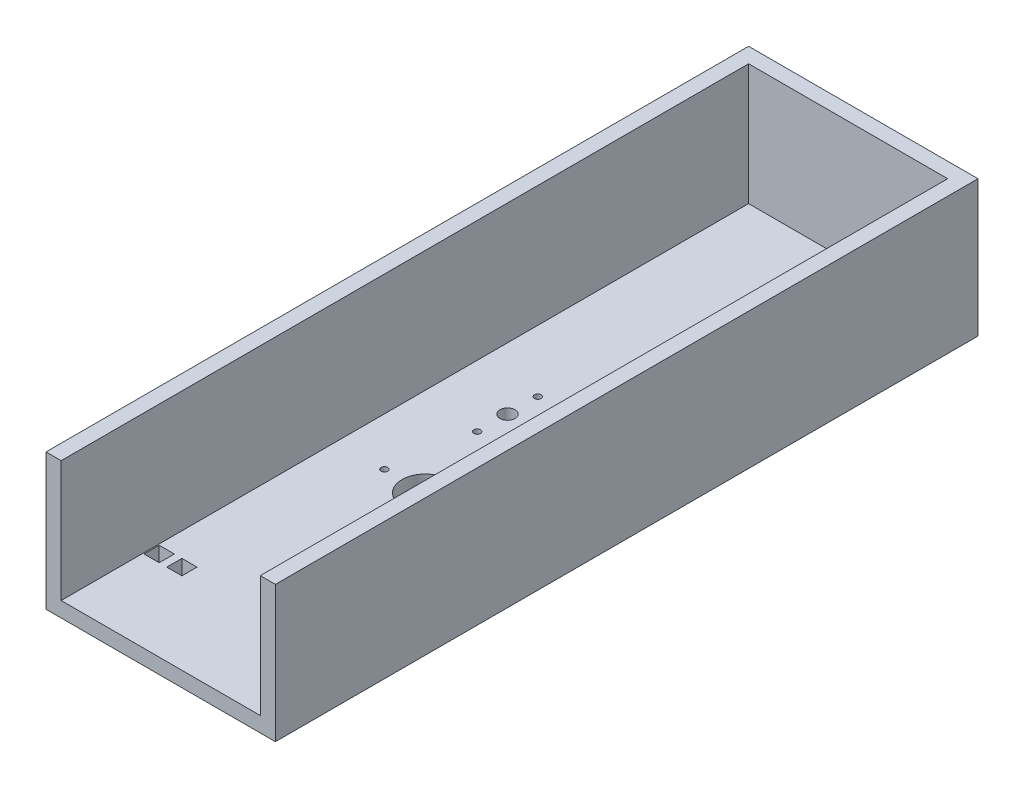
ISO-10303-21;
HEADER;
FILE_DESCRIPTION(('STEP AP214'),'2;1');
FILE_NAME('part.step','',(''),(''),'','','');
FILE_SCHEMA(('AUTOMOTIVE_DESIGN { 1 0 10303 214 1 1 1 1 }'));
ENDSEC;
DATA;
#1=APPLICATION_CONTEXT('core data for automotive mechanical design processes');
#2=APPLICATION_PROTOCOL_DEFINITION('international standard','automotive_design',2000,#1);
#3=PRODUCT_CONTEXT('',#1,'mechanical');
#4=PRODUCT('Part','Part','',(#3));
#5=PRODUCT_RELATED_PRODUCT_CATEGORY('part','',(#4));
#6=PRODUCT_DEFINITION_FORMATION('','',#4);
#7=PRODUCT_DEFINITION_CONTEXT('part definition',#1,'design');
#8=PRODUCT_DEFINITION('design','',#6,#7);
#9=PRODUCT_DEFINITION_SHAPE('','',#8);
#10=(LENGTH_UNIT() NAMED_UNIT(*) SI_UNIT(.MILLI.,.METRE.));
#11=(NAMED_UNIT(*) PLANE_ANGLE_UNIT() SI_UNIT($,.RADIAN.));
#12=(NAMED_UNIT(*) SI_UNIT($,.STERADIAN.) SOLID_ANGLE_UNIT());
#13=UNCERTAINTY_MEASURE_WITH_UNIT(LENGTH_MEASURE(1.E-05),#10,'distance_accuracy_value','');
#14=(GEOMETRIC_REPRESENTATION_CONTEXT(3) GLOBAL_UNCERTAINTY_ASSIGNED_CONTEXT((#13)) GLOBAL_UNIT_ASSIGNED_CONTEXT((#10,
#11,#12)) REPRESENTATION_CONTEXT('',''));
#15=CARTESIAN_POINT('',(0.,0.,0.));
#16=DIRECTION('',(0.,0.,1.));
#17=DIRECTION('',(1.,0.,0.));
#18=AXIS2_PLACEMENT_3D('',#15,#16,#17);
#19=CARTESIAN_POINT('',(41.75,22.225,294.64));
#20=DIRECTION('',(-1.,0.,0.));
#21=DIRECTION('',(0.,0.,1.));
#22=AXIS2_PLACEMENT_3D('',#19,#20,#21);
#23=PLANE('',#22);
#24=DIRECTION('',(0.,0.,-1.));
#25=VECTOR('',#24,1.);
#26=CARTESIAN_POINT('',(41.75,50.8,294.64));
#27=LINE('',#26,#25);
#28=CARTESIAN_POINT('',(41.75,50.8,294.64));
#29=VERTEX_POINT('',#28);
#30=CARTESIAN_POINT('',(41.75,50.8,6.35));
#31=VERTEX_POINT('',#30);
#32=EDGE_CURVE('E451',#29,#31,#27,.T.);
#33=ORIENTED_EDGE('',*,*,#32,.T.);
#34=DIRECTION('',(0.,-1.,0.));
#35=VECTOR('',#34,1.);
#36=CARTESIAN_POINT('',(41.75,134.541104005142,6.35));
#37=LINE('',#36,#35);
#38=CARTESIAN_POINT('',(41.75,0.,6.35));
#39=VERTEX_POINT('',#38);
#40=EDGE_CURVE('E394',#31,#39,#37,.T.);
#41=ORIENTED_EDGE('',*,*,#40,.T.);
#42=DIRECTION('',(0.,0.,-1.));
#43=VECTOR('',#42,1.);
#44=CARTESIAN_POINT('',(41.75,0.,294.64));
#45=LINE('',#44,#43);
#46=CARTESIAN_POINT('',(41.75,0.,294.64));
#47=VERTEX_POINT('',#46);
#48=EDGE_CURVE('E40',#47,#39,#45,.T.);
#49=ORIENTED_EDGE('',*,*,#48,.F.);
#50=DIRECTION('',(0.,1.,0.));
#51=VECTOR('',#50,1.);
#52=CARTESIAN_POINT('',(41.75,0.,294.64));
#53=LINE('',#52,#51);
#54=EDGE_CURVE('E434',#47,#29,#53,.T.);
#55=ORIENTED_EDGE('',*,*,#54,.T.);
#56=EDGE_LOOP('',(#33,#41,#49,#55));
#57=FACE_BOUND('',#56,.T.);
#58=ADVANCED_FACE('F36',(#57),#23,.T.);
#59=CARTESIAN_POINT('',(0.,0.,294.64));
#60=DIRECTION('',(0.,1.,0.));
#61=DIRECTION('',(0.,0.,1.));
#62=AXIS2_PLACEMENT_3D('',#59,#60,#61);
#63=PLANE('',#62);
#64=DIRECTION('',(-1.,0.,0.));
#65=VECTOR('',#64,1.);
#66=CARTESIAN_POINT('',(-34.925,0.,254.));
#67=LINE('',#66,#65);
#68=CARTESIAN_POINT('',(-34.925,0.,254.));
#69=VERTEX_POINT('',#68);
#70=CARTESIAN_POINT('',(-41.2749999999999,0.,254.));
#71=VERTEX_POINT('',#70);
#72=EDGE_CURVE('E277',#69,#71,#67,.T.);
#73=ORIENTED_EDGE('',*,*,#72,.F.);
#74=DIRECTION('',(0.,0.,-1.));
#75=VECTOR('',#74,1.);
#76=CARTESIAN_POINT('',(-34.925,0.,260.35));
#77=LINE('',#76,#75);
#78=CARTESIAN_POINT('',(-34.925,0.,260.35));
#79=VERTEX_POINT('',#78);
#80=EDGE_CURVE('E280',#79,#69,#77,.T.);
#81=ORIENTED_EDGE('',*,*,#80,.F.);
#82=DIRECTION('',(1.,0.,0.));
#83=VECTOR('',#82,1.);
#84=CARTESIAN_POINT('',(-34.925,0.,260.35));
#85=LINE('',#84,#83);
#86=CARTESIAN_POINT('',(-41.2749999999999,0.,260.35));
#87=VERTEX_POINT('',#86);
#88=EDGE_CURVE('E53',#87,#79,#85,.T.);
#89=ORIENTED_EDGE('',*,*,#88,.F.);
#90=DIRECTION('',(0.,0.,1.));
#91=VECTOR('',#90,1.);
#92=CARTESIAN_POINT('',(-41.2749999999999,0.,260.35));
#93=LINE('',#92,#91);
#94=EDGE_CURVE('E274',#71,#87,#93,.T.);
#95=ORIENTED_EDGE('',*,*,#94,.F.);
#96=EDGE_LOOP('',(#73,#81,#89,#95));
#97=FACE_BOUND('',#96,.T.);
#98=DIRECTION('',(1.,0.,0.));
#99=VECTOR('',#98,1.);
#100=CARTESIAN_POINT('',(34.925,0.,260.35));
#101=LINE('',#100,#99);
#102=CARTESIAN_POINT('',(34.925,0.,260.35));
#103=VERTEX_POINT('',#102);
#104=CARTESIAN_POINT('',(41.2749999999999,0.,260.35));
#105=VERTEX_POINT('',#104);
#106=EDGE_CURVE('E246',#103,#105,#101,.T.);
#107=ORIENTED_EDGE('',*,*,#106,.F.);
#108=DIRECTION('',(0.,0.,1.));
#109=VECTOR('',#108,1.);
#110=CARTESIAN_POINT('',(34.925,0.,260.35));
#111=LINE('',#110,#109);
#112=CARTESIAN_POINT('',(34.925,0.,254.));
#113=VERTEX_POINT('',#112);
#114=EDGE_CURVE('E249',#113,#103,#111,.T.);
#115=ORIENTED_EDGE('',*,*,#114,.F.);
#116=DIRECTION('',(-1.,0.,0.));
#117=VECTOR('',#116,1.);
#118=CARTESIAN_POINT('',(34.925,0.,254.));
#119=LINE('',#118,#117);
#120=CARTESIAN_POINT('',(41.2749999999999,0.,254.));
#121=VERTEX_POINT('',#120);
#122=EDGE_CURVE('E61',#121,#113,#119,.T.);
#123=ORIENTED_EDGE('',*,*,#122,.F.);
#124=DIRECTION('',(0.,0.,-1.));
#125=VECTOR('',#124,1.);
#126=CARTESIAN_POINT('',(41.2749999999999,0.,260.35));
#127=LINE('',#126,#125);
#128=EDGE_CURVE('E243',#105,#121,#127,.T.);
#129=ORIENTED_EDGE('',*,*,#128,.F.);
#130=EDGE_LOOP('',(#107,#115,#123,#129));
#131=FACE_BOUND('',#130,.T.);
#132=DIRECTION('',(-1.,0.,0.));
#133=VECTOR('',#132,1.);
#134=CARTESIAN_POINT('',(-25.4,0.,254.));
#135=LINE('',#134,#133);
#136=CARTESIAN_POINT('',(-25.4,0.,254.));
#137=VERTEX_POINT('',#136);
#138=CARTESIAN_POINT('',(-31.75,0.,254.));
#139=VERTEX_POINT('',#138);
#140=EDGE_CURVE('E217',#137,#139,#135,.T.);
#141=ORIENTED_EDGE('',*,*,#140,.F.);
#142=DIRECTION('',(0.,0.,-1.));
#143=VECTOR('',#142,1.);
#144=CARTESIAN_POINT('',(-25.4,0.,260.35));
#145=LINE('',#144,#143);
#146=CARTESIAN_POINT('',(-25.4,0.,260.35));
#147=VERTEX_POINT('',#146);
#148=EDGE_CURVE('E229',#147,#137,#145,.T.);
#149=ORIENTED_EDGE('',*,*,#148,.F.);
#150=DIRECTION('',(1.,0.,0.));
#151=VECTOR('',#150,1.);
#152=CARTESIAN_POINT('',(-25.4,0.,260.35));
#153=LINE('',#152,#151);
#154=CARTESIAN_POINT('',(-31.75,0.,260.35));
#155=VERTEX_POINT('',#154);
#156=EDGE_CURVE('E223',#155,#147,#153,.T.);
#157=ORIENTED_EDGE('',*,*,#156,.F.);
#158=DIRECTION('',(0.,0.,1.));
#159=VECTOR('',#158,1.);
#160=CARTESIAN_POINT('',(-31.75,0.,260.35));
#161=LINE('',#160,#159);
#162=EDGE_CURVE('E225',#139,#155,#161,.T.);
#163=ORIENTED_EDGE('',*,*,#162,.F.);
#164=EDGE_LOOP('',(#141,#149,#157,#163));
#165=FACE_BOUND('',#164,.T.);
#166=DIRECTION('',(-1.,0.,0.));
#167=VECTOR('',#166,1.);
#168=CARTESIAN_POINT('',(31.75,0.,254.));
#169=LINE('',#168,#167);
#170=CARTESIAN_POINT('',(31.75,0.,254.));
#171=VERTEX_POINT('',#170);
#172=CARTESIAN_POINT('',(25.4,0.,254.));
#173=VERTEX_POINT('',#172);
#174=EDGE_CURVE('E307',#171,#173,#169,.T.);
#175=ORIENTED_EDGE('',*,*,#174,.F.);
#176=DIRECTION('',(0.,0.,-1.));
#177=VECTOR('',#176,1.);
#178=CARTESIAN_POINT('',(31.75,0.,260.35));
#179=LINE('',#178,#177);
#180=CARTESIAN_POINT('',(31.75,0.,260.35));
#181=VERTEX_POINT('',#180);
#182=EDGE_CURVE('E240',#181,#171,#179,.T.);
#183=ORIENTED_EDGE('',*,*,#182,.F.);
#184=DIRECTION('',(1.,0.,0.));
#185=VECTOR('',#184,1.);
#186=CARTESIAN_POINT('',(31.75,0.,260.35));
#187=LINE('',#186,#185);
#188=CARTESIAN_POINT('',(25.4,0.,260.35));
#189=VERTEX_POINT('',#188);
#190=EDGE_CURVE('E301',#189,#181,#187,.T.);
#191=ORIENTED_EDGE('',*,*,#190,.F.);
#192=DIRECTION('',(0.,0.,1.));
#193=VECTOR('',#192,1.);
#194=CARTESIAN_POINT('',(25.4,0.,260.35));
#195=LINE('',#194,#193);
#196=EDGE_CURVE('E304',#173,#189,#195,.T.);
#197=ORIENTED_EDGE('',*,*,#196,.F.);
#198=EDGE_LOOP('',(#175,#183,#191,#197));
#199=FACE_BOUND('',#198,.T.);
#200=CARTESIAN_POINT('',(-15.8749986,0.,146.05));
#201=DIRECTION('',(0.,1.,0.));
#202=DIRECTION('',(0.,0.,1.));
#203=AXIS2_PLACEMENT_3D('',#200,#201,#202);
#204=CIRCLE('',#203,1.3890625);
#205=CARTESIAN_POINT('',(-15.8749986,0.,147.4390625));
#206=VERTEX_POINT('',#205);
#207=EDGE_CURVE('E365',#206,#206,#204,.F.);
#208=ORIENTED_EDGE('',*,*,#207,.T.);
#209=EDGE_LOOP('',(#208));
#210=FACE_BOUND('',#209,.T.);
#211=CARTESIAN_POINT('',(15.8749986,0.,120.65));
#212=DIRECTION('',(0.,1.,0.));
#213=DIRECTION('',(0.,0.,1.));
#214=AXIS2_PLACEMENT_3D('',#211,#212,#213);
#215=CIRCLE('',#214,1.38906250000001);
#216=CARTESIAN_POINT('',(15.8749986,0.,122.0390625));
#217=VERTEX_POINT('',#216);
#218=EDGE_CURVE('E362',#217,#217,#215,.F.);
#219=ORIENTED_EDGE('',*,*,#218,.T.);
#220=EDGE_LOOP('',(#219));
#221=FACE_BOUND('',#220,.T.);
#222=CARTESIAN_POINT('',(15.8749986,0.,146.05));
#223=DIRECTION('',(0.,1.,0.));
#224=DIRECTION('',(0.,0.,1.));
#225=AXIS2_PLACEMENT_3D('',#222,#223,#224);
#226=CIRCLE('',#225,1.38906250000002);
#227=CARTESIAN_POINT('',(15.8749986,0.,147.4390625));
#228=VERTEX_POINT('',#227);
#229=EDGE_CURVE('E359',#228,#228,#226,.F.);
#230=ORIENTED_EDGE('',*,*,#229,.T.);
#231=EDGE_LOOP('',(#230));
#232=FACE_BOUND('',#231,.T.);
#233=CARTESIAN_POINT('',(-15.8749986,0.,133.35));
#234=DIRECTION('',(0.,1.,0.));
#235=DIRECTION('',(0.,0.,1.));
#236=AXIS2_PLACEMENT_3D('',#233,#234,#235);
#237=CIRCLE('',#236,3.175);
#238=CARTESIAN_POINT('',(-15.8749986,0.,136.525));
#239=VERTEX_POINT('',#238);
#240=EDGE_CURVE('E356',#239,#239,#237,.F.);
#241=ORIENTED_EDGE('',*,*,#240,.T.);
#242=EDGE_LOOP('',(#241));
#243=FACE_BOUND('',#242,.T.);
#244=CARTESIAN_POINT('',(-15.8749986,0.,120.65));
#245=DIRECTION('',(0.,1.,0.));
#246=DIRECTION('',(0.,0.,1.));
#247=AXIS2_PLACEMENT_3D('',#244,#245,#246);
#248=CIRCLE('',#247,1.3890625);
#249=CARTESIAN_POINT('',(-15.8749986,0.,122.0390625));
#250=VERTEX_POINT('',#249);
#251=EDGE_CURVE('E353',#250,#250,#248,.F.);
#252=ORIENTED_EDGE('',*,*,#251,.T.);
#253=EDGE_LOOP('',(#252));
#254=FACE_BOUND('',#253,.T.);
#255=CARTESIAN_POINT('',(15.8749986,0.,133.35));
#256=DIRECTION('',(0.,1.,0.));
#257=DIRECTION('',(0.,0.,1.));
#258=AXIS2_PLACEMENT_3D('',#255,#256,#257);
#259=CIRCLE('',#258,3.175);
#260=CARTESIAN_POINT('',(15.8749986,0.,136.525));
#261=VERTEX_POINT('',#260);
#262=EDGE_CURVE('E350',#261,#261,#259,.F.);
#263=ORIENTED_EDGE('',*,*,#262,.T.);
#264=EDGE_LOOP('',(#263));
#265=FACE_BOUND('',#264,.T.);
#266=CARTESIAN_POINT('',(12.6549897975543,0.,179.209178052848));
#267=DIRECTION('',(0.,1.,0.));
#268=DIRECTION('',(0.,0.,1.));
#269=AXIS2_PLACEMENT_3D('',#266,#267,#268);
#270=CIRCLE('',#269,1.3890625);
#271=CARTESIAN_POINT('',(12.6549897975543,0.,180.598240552847));
#272=VERTEX_POINT('',#271);
#273=EDGE_CURVE('E376',#272,#272,#270,.T.);
#274=ORIENTED_EDGE('',*,*,#273,.F.);
#275=EDGE_LOOP('',(#274));
#276=FACE_BOUND('',#275,.T.);
#277=CARTESIAN_POINT('',(-21.6350102024457,0.,179.209178052848));
#278=DIRECTION('',(0.,1.,0.));
#279=DIRECTION('',(0.,0.,1.));
#280=AXIS2_PLACEMENT_3D('',#277,#278,#279);
#281=CIRCLE('',#280,1.3890625);
#282=CARTESIAN_POINT('',(-21.6350102024457,0.,180.598240552847));
#283=VERTEX_POINT('',#282);
#284=EDGE_CURVE('E369',#283,#283,#281,.T.);
#285=ORIENTED_EDGE('',*,*,#284,.F.);
#286=EDGE_LOOP('',(#285));
#287=FACE_BOUND('',#286,.T.);
#288=CARTESIAN_POINT('',(-4.49001020244575,0.,179.209178052848));
#289=DIRECTION('',(0.,1.,0.));
#290=DIRECTION('',(0.,0.,1.));
#291=AXIS2_PLACEMENT_3D('',#288,#289,#290);
#292=CIRCLE('',#291,9.72819999999998);
#293=CARTESIAN_POINT('',(-4.49001020244575,0.,188.937378052847));
#294=VERTEX_POINT('',#293);
#295=EDGE_CURVE('E381',#294,#294,#292,.T.);
#296=ORIENTED_EDGE('',*,*,#295,.F.);
#297=EDGE_LOOP('',(#296));
#298=FACE_BOUND('',#297,.T.);
#299=CARTESIAN_POINT('',(0.,0.,12.7));
#300=DIRECTION('',(0.,1.,0.));
#301=DIRECTION('',(0.,0.,1.));
#302=AXIS2_PLACEMENT_3D('',#299,#300,#301);
#303=CIRCLE('',#302,2.38125);
#304=CARTESIAN_POINT('',(0.,0.,15.08125));
#305=VERTEX_POINT('',#304);
#306=EDGE_CURVE('E390',#305,#305,#303,.F.);
#307=ORIENTED_EDGE('',*,*,#306,.T.);
#308=EDGE_LOOP('',(#307));
#309=FACE_BOUND('',#308,.T.);
#310=CARTESIAN_POINT('',(0.,0.,93.98));
#311=DIRECTION('',(0.,1.,0.));
#312=DIRECTION('',(0.,0.,1.));
#313=AXIS2_PLACEMENT_3D('',#310,#311,#312);
#314=CIRCLE('',#313,2.38125);
#315=CARTESIAN_POINT('',(0.,0.,96.36125));
#316=VERTEX_POINT('',#315);
#317=EDGE_CURVE('E391',#316,#316,#314,.F.);
#318=ORIENTED_EDGE('',*,*,#317,.T.);
#319=EDGE_LOOP('',(#318));
#320=FACE_BOUND('',#319,.T.);
#321=ORIENTED_EDGE('',*,*,#48,.T.);
#322=DIRECTION('',(1.,0.,0.));
#323=VECTOR('',#322,1.);
#324=CARTESIAN_POINT('',(41.75,0.,6.35));
#325=LINE('',#324,#323);
#326=CARTESIAN_POINT('',(-41.75,0.,6.35000000000002));
#327=VERTEX_POINT('',#326);
#328=EDGE_CURVE('E399',#327,#39,#325,.T.);
#329=ORIENTED_EDGE('',*,*,#328,.F.);
#330=DIRECTION('',(0.,0.,-1.));
#331=VECTOR('',#330,1.);
#332=CARTESIAN_POINT('',(-41.75,0.,294.64));
#333=LINE('',#332,#331);
#334=CARTESIAN_POINT('',(-41.75,0.,294.64));
#335=VERTEX_POINT('',#334);
#336=EDGE_CURVE('E416',#335,#327,#333,.T.);
#337=ORIENTED_EDGE('',*,*,#336,.F.);
#338=DIRECTION('',(1.,0.,0.));
#339=VECTOR('',#338,1.);
#340=CARTESIAN_POINT('',(0.,0.,294.64));
#341=LINE('',#340,#339);
#342=EDGE_CURVE('E431',#335,#47,#341,.T.);
#343=ORIENTED_EDGE('',*,*,#342,.T.);
#344=EDGE_LOOP('',(#321,#329,#337,#343));
#345=FACE_BOUND('',#344,.T.);
#346=ADVANCED_FACE('F38',(#97,#131,#165,#199,#210,#221,#232,#243,#254,#265,#276,#287,#298,#309,
#320,#345),#63,.T.);
#347=CARTESIAN_POINT('',(-41.75,22.225,294.64));
#348=DIRECTION('',(1.,0.,0.));
#349=DIRECTION('',(0.,0.,1.));
#350=AXIS2_PLACEMENT_3D('',#347,#348,#349);
#351=PLANE('',#350);
#352=ORIENTED_EDGE('',*,*,#336,.T.);
#353=DIRECTION('',(0.,-1.,0.));
#354=VECTOR('',#353,1.);
#355=CARTESIAN_POINT('',(-41.75,134.541104005142,6.35000000000002));
#356=LINE('',#355,#354);
#357=CARTESIAN_POINT('',(-41.75,50.8,6.35000000000002));
#358=VERTEX_POINT('',#357);
#359=EDGE_CURVE('E402',#358,#327,#356,.T.);
#360=ORIENTED_EDGE('',*,*,#359,.F.);
#361=DIRECTION('',(0.,0.,-1.));
#362=VECTOR('',#361,1.);
#363=CARTESIAN_POINT('',(-41.75,50.8,294.64));
#364=LINE('',#363,#362);
#365=CARTESIAN_POINT('',(-41.75,50.8,294.64));
#366=VERTEX_POINT('',#365);
#367=EDGE_CURVE('E426',#366,#358,#364,.T.);
#368=ORIENTED_EDGE('',*,*,#367,.F.);
#369=DIRECTION('',(0.,1.,0.));
#370=VECTOR('',#369,1.);
#371=CARTESIAN_POINT('',(-41.75,0.,294.64));
#372=LINE('',#371,#370);
#373=EDGE_CURVE('E409',#335,#366,#372,.T.);
#374=ORIENTED_EDGE('',*,*,#373,.F.);
#375=EDGE_LOOP('',(#352,#360,#368,#374));
#376=FACE_BOUND('',#375,.T.);
#377=ADVANCED_FACE('F474',(#376),#351,.T.);
#378=CARTESIAN_POINT('',(48.1,-6.35,294.64));
#379=DIRECTION('',(0.,-1.,0.));
#380=DIRECTION('',(1.,0.,0.));
#381=AXIS2_PLACEMENT_3D('',#378,#379,#380);
#382=PLANE('',#381);
#383=DIRECTION('',(-1.,0.,0.));
#384=VECTOR('',#383,1.);
#385=CARTESIAN_POINT('',(-34.925,-6.35000000000001,254.));
#386=LINE('',#385,#384);
#387=CARTESIAN_POINT('',(-34.9249999999999,-6.35000000000001,254.));
#388=VERTEX_POINT('',#387);
#389=CARTESIAN_POINT('',(-41.2749999999999,-6.35000000000001,254.));
#390=VERTEX_POINT('',#389);
#391=EDGE_CURVE('E273',#388,#390,#386,.T.);
#392=ORIENTED_EDGE('',*,*,#391,.T.);
#393=DIRECTION('',(0.,0.,1.));
#394=VECTOR('',#393,1.);
#395=CARTESIAN_POINT('',(-41.2749999999999,-6.35000000000001,260.35));
#396=LINE('',#395,#394);
#397=CARTESIAN_POINT('',(-41.2749999999999,-6.35000000000001,260.35));
#398=VERTEX_POINT('',#397);
#399=EDGE_CURVE('E294',#390,#398,#396,.T.);
#400=ORIENTED_EDGE('',*,*,#399,.T.);
#401=DIRECTION('',(1.,0.,0.));
#402=VECTOR('',#401,1.);
#403=CARTESIAN_POINT('',(-34.925,-6.35000000000001,260.35));
#404=LINE('',#403,#402);
#405=CARTESIAN_POINT('',(-34.925,-6.35000000000001,260.35));
#406=VERTEX_POINT('',#405);
#407=EDGE_CURVE('E290',#398,#406,#404,.T.);
#408=ORIENTED_EDGE('',*,*,#407,.T.);
#409=DIRECTION('',(0.,0.,-1.));
#410=VECTOR('',#409,1.);
#411=CARTESIAN_POINT('',(-34.925,-6.35000000000001,260.35));
#412=LINE('',#411,#410);
#413=EDGE_CURVE('E286',#406,#388,#412,.T.);
#414=ORIENTED_EDGE('',*,*,#413,.T.);
#415=EDGE_LOOP('',(#392,#400,#408,#414));
#416=FACE_BOUND('',#415,.T.);
#417=DIRECTION('',(1.,0.,0.));
#418=VECTOR('',#417,1.);
#419=CARTESIAN_POINT('',(34.925,-6.35,260.35));
#420=LINE('',#419,#418);
#421=CARTESIAN_POINT('',(34.925,-6.35,260.35));
#422=VERTEX_POINT('',#421);
#423=CARTESIAN_POINT('',(41.2749999999999,-6.35,260.35));
#424=VERTEX_POINT('',#423);
#425=EDGE_CURVE('E242',#422,#424,#420,.T.);
#426=ORIENTED_EDGE('',*,*,#425,.T.);
#427=DIRECTION('',(0.,0.,-1.));
#428=VECTOR('',#427,1.);
#429=CARTESIAN_POINT('',(41.2749999999999,-6.35,260.35));
#430=LINE('',#429,#428);
#431=CARTESIAN_POINT('',(41.2749999999999,-6.35,254.));
#432=VERTEX_POINT('',#431);
#433=EDGE_CURVE('E265',#424,#432,#430,.T.);
#434=ORIENTED_EDGE('',*,*,#433,.T.);
#435=DIRECTION('',(-1.,0.,0.));
#436=VECTOR('',#435,1.);
#437=CARTESIAN_POINT('',(34.925,-6.35,254.));
#438=LINE('',#437,#436);
#439=CARTESIAN_POINT('',(34.925,-6.35,254.));
#440=VERTEX_POINT('',#439);
#441=EDGE_CURVE('E261',#432,#440,#438,.T.);
#442=ORIENTED_EDGE('',*,*,#441,.T.);
#443=DIRECTION('',(0.,0.,1.));
#444=VECTOR('',#443,1.);
#445=CARTESIAN_POINT('',(34.925,-6.35,260.35));
#446=LINE('',#445,#444);
#447=EDGE_CURVE('E256',#440,#422,#446,.T.);
#448=ORIENTED_EDGE('',*,*,#447,.T.);
#449=EDGE_LOOP('',(#426,#434,#442,#448));
#450=FACE_BOUND('',#449,.T.);
#451=DIRECTION('',(-1.,0.,0.));
#452=VECTOR('',#451,1.);
#453=CARTESIAN_POINT('',(-25.4,-6.35000000000001,254.));
#454=LINE('',#453,#452);
#455=CARTESIAN_POINT('',(-25.4,-6.35000000000001,254.));
#456=VERTEX_POINT('',#455);
#457=CARTESIAN_POINT('',(-31.75,-6.35000000000001,254.));
#458=VERTEX_POINT('',#457);
#459=EDGE_CURVE('E214',#456,#458,#454,.T.);
#460=ORIENTED_EDGE('',*,*,#459,.T.);
#461=DIRECTION('',(0.,0.,1.));
#462=VECTOR('',#461,1.);
#463=CARTESIAN_POINT('',(-31.75,-6.35000000000001,260.35));
#464=LINE('',#463,#462);
#465=CARTESIAN_POINT('',(-31.75,-6.35000000000001,260.35));
#466=VERTEX_POINT('',#465);
#467=EDGE_CURVE('E200',#458,#466,#464,.T.);
#468=ORIENTED_EDGE('',*,*,#467,.T.);
#469=DIRECTION('',(1.,0.,0.));
#470=VECTOR('',#469,1.);
#471=CARTESIAN_POINT('',(-25.4,-6.35000000000001,260.35));
#472=LINE('',#471,#470);
#473=CARTESIAN_POINT('',(-25.4,-6.35000000000001,260.35));
#474=VERTEX_POINT('',#473);
#475=EDGE_CURVE('E234',#466,#474,#472,.T.);
#476=ORIENTED_EDGE('',*,*,#475,.T.);
#477=DIRECTION('',(0.,0.,-1.));
#478=VECTOR('',#477,1.);
#479=CARTESIAN_POINT('',(-25.4,-6.35000000000001,260.35));
#480=LINE('',#479,#478);
#481=EDGE_CURVE('E222',#474,#456,#480,.T.);
#482=ORIENTED_EDGE('',*,*,#481,.T.);
#483=EDGE_LOOP('',(#460,#468,#476,#482));
#484=FACE_BOUND('',#483,.T.);
#485=DIRECTION('',(-1.,0.,0.));
#486=VECTOR('',#485,1.);
#487=CARTESIAN_POINT('',(31.75,-6.35,254.));
#488=LINE('',#487,#486);
#489=CARTESIAN_POINT('',(31.75,-6.35,254.));
#490=VERTEX_POINT('',#489);
#491=CARTESIAN_POINT('',(25.4,-6.35,254.));
#492=VERTEX_POINT('',#491);
#493=EDGE_CURVE('E303',#490,#492,#488,.T.);
#494=ORIENTED_EDGE('',*,*,#493,.T.);
#495=DIRECTION('',(0.,0.,1.));
#496=VECTOR('',#495,1.);
#497=CARTESIAN_POINT('',(25.4,-6.35,260.35));
#498=LINE('',#497,#496);
#499=CARTESIAN_POINT('',(25.4,-6.35,260.35));
#500=VERTEX_POINT('',#499);
#501=EDGE_CURVE('E324',#492,#500,#498,.T.);
#502=ORIENTED_EDGE('',*,*,#501,.T.);
#503=DIRECTION('',(1.,0.,0.));
#504=VECTOR('',#503,1.);
#505=CARTESIAN_POINT('',(31.75,-6.35,260.35));
#506=LINE('',#505,#504);
#507=CARTESIAN_POINT('',(31.75,-6.35,260.35));
#508=VERTEX_POINT('',#507);
#509=EDGE_CURVE('E320',#500,#508,#506,.T.);
#510=ORIENTED_EDGE('',*,*,#509,.T.);
#511=DIRECTION('',(0.,0.,-1.));
#512=VECTOR('',#511,1.);
#513=CARTESIAN_POINT('',(31.75,-6.35,260.35));
#514=LINE('',#513,#512);
#515=EDGE_CURVE('E315',#508,#490,#514,.T.);
#516=ORIENTED_EDGE('',*,*,#515,.T.);
#517=EDGE_LOOP('',(#494,#502,#510,#516));
#518=FACE_BOUND('',#517,.T.);
#519=CARTESIAN_POINT('',(-15.8749986,-6.35000000000001,146.05));
#520=DIRECTION('',(0.,-1.,0.));
#521=DIRECTION('',(1.,0.,0.));
#522=AXIS2_PLACEMENT_3D('',#519,#520,#521);
#523=CIRCLE('',#522,1.3890625);
#524=CARTESIAN_POINT('',(-14.4859361,-6.35000000000001,146.05));
#525=VERTEX_POINT('',#524);
#526=EDGE_CURVE('E335',#525,#525,#523,.F.);
#527=ORIENTED_EDGE('',*,*,#526,.T.);
#528=EDGE_LOOP('',(#527));
#529=FACE_BOUND('',#528,.T.);
#530=CARTESIAN_POINT('',(15.8749986,-6.35,120.65));
#531=DIRECTION('',(0.,-1.,0.));
#532=DIRECTION('',(1.,0.,0.));
#533=AXIS2_PLACEMENT_3D('',#530,#531,#532);
#534=CIRCLE('',#533,1.38906250000001);
#535=CARTESIAN_POINT('',(17.2640611,-6.35,120.65));
#536=VERTEX_POINT('',#535);
#537=EDGE_CURVE('E336',#536,#536,#534,.F.);
#538=ORIENTED_EDGE('',*,*,#537,.T.);
#539=EDGE_LOOP('',(#538));
#540=FACE_BOUND('',#539,.T.);
#541=CARTESIAN_POINT('',(15.8749986,-6.35,146.05));
#542=DIRECTION('',(0.,-1.,0.));
#543=DIRECTION('',(1.,0.,0.));
#544=AXIS2_PLACEMENT_3D('',#541,#542,#543);
#545=CIRCLE('',#544,1.38906250000002);
#546=CARTESIAN_POINT('',(17.2640611,-6.35,146.05));
#547=VERTEX_POINT('',#546);
#548=EDGE_CURVE('E339',#547,#547,#545,.F.);
#549=ORIENTED_EDGE('',*,*,#548,.T.);
#550=EDGE_LOOP('',(#549));
#551=FACE_BOUND('',#550,.T.);
#552=CARTESIAN_POINT('',(-15.8749986,-6.35000000000001,133.35));
#553=DIRECTION('',(0.,-1.,0.));
#554=DIRECTION('',(1.,0.,0.));
#555=AXIS2_PLACEMENT_3D('',#552,#553,#554);
#556=CIRCLE('',#555,3.175);
#557=CARTESIAN_POINT('',(-12.6999986,-6.35000000000001,133.35));
#558=VERTEX_POINT('',#557);
#559=EDGE_CURVE('E342',#558,#558,#556,.F.);
#560=ORIENTED_EDGE('',*,*,#559,.T.);
#561=EDGE_LOOP('',(#560));
#562=FACE_BOUND('',#561,.T.);
#563=CARTESIAN_POINT('',(-15.8749986,-6.35000000000001,120.65));
#564=DIRECTION('',(0.,-1.,0.));
#565=DIRECTION('',(1.,0.,0.));
#566=AXIS2_PLACEMENT_3D('',#563,#564,#565);
#567=CIRCLE('',#566,1.3890625);
#568=CARTESIAN_POINT('',(-14.4859361,-6.35000000000001,120.65));
#569=VERTEX_POINT('',#568);
#570=EDGE_CURVE('E332',#569,#569,#567,.F.);
#571=ORIENTED_EDGE('',*,*,#570,.T.);
#572=EDGE_LOOP('',(#571));
#573=FACE_BOUND('',#572,.T.);
#574=CARTESIAN_POINT('',(15.8749986,-6.35,133.35));
#575=DIRECTION('',(0.,-1.,0.));
#576=DIRECTION('',(1.,0.,0.));
#577=AXIS2_PLACEMENT_3D('',#574,#575,#576);
#578=CIRCLE('',#577,3.175);
#579=CARTESIAN_POINT('',(19.0499986,-6.35,133.35));
#580=VERTEX_POINT('',#579);
#581=EDGE_CURVE('E345',#580,#580,#578,.F.);
#582=ORIENTED_EDGE('',*,*,#581,.T.);
#583=EDGE_LOOP('',(#582));
#584=FACE_BOUND('',#583,.T.);
#585=CARTESIAN_POINT('',(12.6549897975543,-6.35,179.209178052848));
#586=DIRECTION('',(0.,-1.,0.));
#587=DIRECTION('',(1.,0.,0.));
#588=AXIS2_PLACEMENT_3D('',#585,#586,#587);
#589=CIRCLE('',#588,1.3890625);
#590=CARTESIAN_POINT('',(14.0440522975543,-6.35,179.209178052848));
#591=VERTEX_POINT('',#590);
#592=EDGE_CURVE('E368',#591,#591,#589,.F.);
#593=ORIENTED_EDGE('',*,*,#592,.T.);
#594=EDGE_LOOP('',(#593));
#595=FACE_BOUND('',#594,.T.);
#596=CARTESIAN_POINT('',(-21.6350102024457,-6.35000000000001,179.209178052848));
#597=DIRECTION('',(0.,-1.,0.));
#598=DIRECTION('',(1.,0.,0.));
#599=AXIS2_PLACEMENT_3D('',#596,#597,#598);
#600=CIRCLE('',#599,1.3890625);
#601=CARTESIAN_POINT('',(-20.2459477024457,-6.35000000000001,179.209178052848));
#602=VERTEX_POINT('',#601);
#603=EDGE_CURVE('E373',#602,#602,#600,.F.);
#604=ORIENTED_EDGE('',*,*,#603,.T.);
#605=EDGE_LOOP('',(#604));
#606=FACE_BOUND('',#605,.T.);
#607=CARTESIAN_POINT('',(-4.49001020244575,-6.35,179.209178052848));
#608=DIRECTION('',(0.,-1.,0.));
#609=DIRECTION('',(1.,0.,0.));
#610=AXIS2_PLACEMENT_3D('',#607,#608,#609);
#611=CIRCLE('',#610,9.72819999999998);
#612=CARTESIAN_POINT('',(5.23818979755424,-6.35,179.209178052848));
#613=VERTEX_POINT('',#612);
#614=EDGE_CURVE('E372',#613,#613,#611,.F.);
#615=ORIENTED_EDGE('',*,*,#614,.T.);
#616=EDGE_LOOP('',(#615));
#617=FACE_BOUND('',#616,.T.);
#618=CARTESIAN_POINT('',(0.,-6.35,12.7));
#619=DIRECTION('',(0.,-1.,0.));
#620=DIRECTION('',(1.,0.,0.));
#621=AXIS2_PLACEMENT_3D('',#618,#619,#620);
#622=CIRCLE('',#621,2.38125);
#623=CARTESIAN_POINT('',(2.38125,-6.35,12.7));
#624=VERTEX_POINT('',#623);
#625=EDGE_CURVE('E387',#624,#624,#622,.T.);
#626=ORIENTED_EDGE('',*,*,#625,.F.);
#627=EDGE_LOOP('',(#626));
#628=FACE_BOUND('',#627,.T.);
#629=CARTESIAN_POINT('',(0.,-6.35,93.98));
#630=DIRECTION('',(0.,-1.,0.));
#631=DIRECTION('',(1.,0.,0.));
#632=AXIS2_PLACEMENT_3D('',#629,#630,#631);
#633=CIRCLE('',#632,2.38125);
#634=CARTESIAN_POINT('',(2.38124999999999,-6.35,93.98));
#635=VERTEX_POINT('',#634);
#636=EDGE_CURVE('E384',#635,#635,#633,.T.);
#637=ORIENTED_EDGE('',*,*,#636,.F.);
#638=EDGE_LOOP('',(#637));
#639=FACE_BOUND('',#638,.T.);
#640=DIRECTION('',(-1.,0.,0.));
#641=VECTOR('',#640,1.);
#642=CARTESIAN_POINT('',(48.1,-6.35,0.));
#643=LINE('',#642,#641);
#644=CARTESIAN_POINT('',(48.1,-6.35,0.));
#645=VERTEX_POINT('',#644);
#646=CARTESIAN_POINT('',(-48.1,-6.35,0.));
#647=VERTEX_POINT('',#646);
#648=EDGE_CURVE('E435',#645,#647,#643,.T.);
#649=ORIENTED_EDGE('',*,*,#648,.F.);
#650=DIRECTION('',(0.,0.,-1.));
#651=VECTOR('',#650,1.);
#652=CARTESIAN_POINT('',(48.1,-6.35,294.64));
#653=LINE('',#652,#651);
#654=CARTESIAN_POINT('',(48.1,-6.35,294.64));
#655=VERTEX_POINT('',#654);
#656=EDGE_CURVE('E11',#655,#645,#653,.T.);
#657=ORIENTED_EDGE('',*,*,#656,.F.);
#658=DIRECTION('',(-1.,0.,0.));
#659=VECTOR('',#658,1.);
#660=CARTESIAN_POINT('',(48.1,-6.35,294.64));
#661=LINE('',#660,#659);
#662=CARTESIAN_POINT('',(-48.1,-6.35,294.64));
#663=VERTEX_POINT('',#662);
#664=EDGE_CURVE('E443',#655,#663,#661,.T.);
#665=ORIENTED_EDGE('',*,*,#664,.T.);
#666=DIRECTION('',(0.,0.,-1.));
#667=VECTOR('',#666,1.);
#668=CARTESIAN_POINT('',(-48.1,-6.35,294.64));
#669=LINE('',#668,#667);
#670=EDGE_CURVE('E419',#663,#647,#669,.T.);
#671=ORIENTED_EDGE('',*,*,#670,.T.);
#672=EDGE_LOOP('',(#649,#657,#665,#671));
#673=FACE_BOUND('',#672,.T.);
#674=ADVANCED_FACE('F220',(#416,#450,#484,#518,#529,#540,#551,#562,#573,#584,#595,#606,#617,
#628,#639,#673),#382,.T.);
#675=CARTESIAN_POINT('',(48.1,50.8,294.64));
#676=DIRECTION('',(1.,0.,0.));
#677=DIRECTION('',(0.,1.,0.));
#678=AXIS2_PLACEMENT_3D('',#675,#676,#677);
#679=PLANE('',#678);
#680=DIRECTION('',(0.,-1.,0.));
#681=VECTOR('',#680,1.);
#682=CARTESIAN_POINT('',(48.1,50.8,0.));
#683=LINE('',#682,#681);
#684=CARTESIAN_POINT('',(48.1,50.8,0.));
#685=VERTEX_POINT('',#684);
#686=EDGE_CURVE('E447',#685,#645,#683,.T.);
#687=ORIENTED_EDGE('',*,*,#686,.F.);
#688=DIRECTION('',(0.,0.,-1.));
#689=VECTOR('',#688,1.);
#690=CARTESIAN_POINT('',(48.1,50.8,294.64));
#691=LINE('',#690,#689);
#692=CARTESIAN_POINT('',(48.1,50.8,294.64));
#693=VERTEX_POINT('',#692);
#694=EDGE_CURVE('E45',#693,#685,#691,.T.);
#695=ORIENTED_EDGE('',*,*,#694,.F.);
#696=DIRECTION('',(0.,-1.,0.));
#697=VECTOR('',#696,1.);
#698=CARTESIAN_POINT('',(48.1,50.8,294.64));
#699=LINE('',#698,#697);
#700=EDGE_CURVE('E440',#693,#655,#699,.T.);
#701=ORIENTED_EDGE('',*,*,#700,.T.);
#702=ORIENTED_EDGE('',*,*,#656,.T.);
#703=EDGE_LOOP('',(#687,#695,#701,#702));
#704=FACE_BOUND('',#703,.T.);
#705=ADVANCED_FACE('F485',(#704),#679,.T.);
#706=CARTESIAN_POINT('',(41.75,50.8,294.64));
#707=DIRECTION('',(0.,1.,0.));
#708=DIRECTION('',(0.,0.,1.));
#709=AXIS2_PLACEMENT_3D('',#706,#707,#708);
#710=PLANE('',#709);
#711=DIRECTION('',(1.,0.,0.));
#712=VECTOR('',#711,1.);
#713=CARTESIAN_POINT('',(41.75,50.8,0.));
#714=LINE('',#713,#712);
#715=CARTESIAN_POINT('',(-48.1,50.8,0.));
#716=VERTEX_POINT('',#715);
#717=EDGE_CURVE('E422',#716,#685,#714,.T.);
#718=ORIENTED_EDGE('',*,*,#717,.F.);
#719=DIRECTION('',(0.,0.,-1.));
#720=VECTOR('',#719,1.);
#721=CARTESIAN_POINT('',(-48.1,50.8,294.64));
#722=LINE('',#721,#720);
#723=CARTESIAN_POINT('',(-48.1,50.8,294.64));
#724=VERTEX_POINT('',#723);
#725=EDGE_CURVE('E423',#724,#716,#722,.T.);
#726=ORIENTED_EDGE('',*,*,#725,.F.);
#727=DIRECTION('',(-1.,0.,0.));
#728=VECTOR('',#727,1.);
#729=CARTESIAN_POINT('',(-41.75,50.8,294.64));
#730=LINE('',#729,#728);
#731=EDGE_CURVE('E411',#366,#724,#730,.T.);
#732=ORIENTED_EDGE('',*,*,#731,.F.);
#733=ORIENTED_EDGE('',*,*,#367,.T.);
#734=DIRECTION('',(1.,0.,0.));
#735=VECTOR('',#734,1.);
#736=CARTESIAN_POINT('',(41.75,50.8,6.35));
#737=LINE('',#736,#735);
#738=EDGE_CURVE('E401',#358,#31,#737,.T.);
#739=ORIENTED_EDGE('',*,*,#738,.T.);
#740=ORIENTED_EDGE('',*,*,#32,.F.);
#741=DIRECTION('',(1.,0.,0.));
#742=VECTOR('',#741,1.);
#743=CARTESIAN_POINT('',(41.75,50.8,294.64));
#744=LINE('',#743,#742);
#745=EDGE_CURVE('E437',#29,#693,#744,.T.);
#746=ORIENTED_EDGE('',*,*,#745,.T.);
#747=ORIENTED_EDGE('',*,*,#694,.T.);
#748=EDGE_LOOP('',(#718,#726,#732,#733,#739,#740,#746,#747));
#749=FACE_BOUND('',#748,.T.);
#750=ADVANCED_FACE('F466',(#749),#710,.T.);
#751=CARTESIAN_POINT('',(0.,0.,294.64));
#752=DIRECTION('',(0.,0.,-1.));
#753=DIRECTION('',(-1.,0.,0.));
#754=AXIS2_PLACEMENT_3D('',#751,#752,#753);
#755=PLANE('',#754);
#756=ORIENTED_EDGE('',*,*,#342,.F.);
#757=ORIENTED_EDGE('',*,*,#373,.T.);
#758=ORIENTED_EDGE('',*,*,#731,.T.);
#759=DIRECTION('',(0.,-1.,0.));
#760=VECTOR('',#759,1.);
#761=CARTESIAN_POINT('',(-48.1,50.8,294.64));
#762=LINE('',#761,#760);
#763=EDGE_CURVE('E413',#724,#663,#762,.T.);
#764=ORIENTED_EDGE('',*,*,#763,.T.);
#765=ORIENTED_EDGE('',*,*,#664,.F.);
#766=ORIENTED_EDGE('',*,*,#700,.F.);
#767=ORIENTED_EDGE('',*,*,#745,.F.);
#768=ORIENTED_EDGE('',*,*,#54,.F.);
#769=EDGE_LOOP('',(#756,#757,#758,#764,#765,#766,#767,#768));
#770=FACE_BOUND('',#769,.T.);
#771=ADVANCED_FACE('F462',(#770),#755,.F.);
#772=CARTESIAN_POINT('',(0.,0.,0.));
#773=DIRECTION('',(0.,0.,-1.));
#774=DIRECTION('',(-1.,0.,0.));
#775=AXIS2_PLACEMENT_3D('',#772,#773,#774);
#776=PLANE('',#775);
#777=DIRECTION('',(0.,-1.,0.));
#778=VECTOR('',#777,1.);
#779=CARTESIAN_POINT('',(-48.1,50.8,0.));
#780=LINE('',#779,#778);
#781=EDGE_CURVE('E405',#716,#647,#780,.T.);
#782=ORIENTED_EDGE('',*,*,#781,.F.);
#783=ORIENTED_EDGE('',*,*,#717,.T.);
#784=ORIENTED_EDGE('',*,*,#686,.T.);
#785=ORIENTED_EDGE('',*,*,#648,.T.);
#786=EDGE_LOOP('',(#782,#783,#784,#785));
#787=FACE_BOUND('',#786,.T.);
#788=ADVANCED_FACE('F487',(#787),#776,.T.);
#789=CARTESIAN_POINT('',(-48.1,50.8,294.64));
#790=DIRECTION('',(-1.,0.,0.));
#791=DIRECTION('',(0.,1.,0.));
#792=AXIS2_PLACEMENT_3D('',#789,#790,#791);
#793=PLANE('',#792);
#794=ORIENTED_EDGE('',*,*,#781,.T.);
#795=ORIENTED_EDGE('',*,*,#670,.F.);
#796=ORIENTED_EDGE('',*,*,#763,.F.);
#797=ORIENTED_EDGE('',*,*,#725,.T.);
#798=EDGE_LOOP('',(#794,#795,#796,#797));
#799=FACE_BOUND('',#798,.T.);
#800=ADVANCED_FACE('F481',(#799),#793,.T.);
#801=CARTESIAN_POINT('',(41.75,134.541104005142,6.35));
#802=DIRECTION('',(0.,0.,-1.));
#803=DIRECTION('',(-1.,0.,0.));
#804=AXIS2_PLACEMENT_3D('',#801,#802,#803);
#805=PLANE('',#804);
#806=ORIENTED_EDGE('',*,*,#738,.F.);
#807=ORIENTED_EDGE('',*,*,#359,.T.);
#808=ORIENTED_EDGE('',*,*,#328,.T.);
#809=ORIENTED_EDGE('',*,*,#40,.F.);
#810=EDGE_LOOP('',(#806,#807,#808,#809));
#811=FACE_BOUND('',#810,.T.);
#812=ADVANCED_FACE('F472',(#811),#805,.F.);
#813=CARTESIAN_POINT('',(0.,6.73519209080187,93.98));
#814=DIRECTION('',(0.,-1.,0.));
#815=DIRECTION('',(1.,0.,0.));
#816=AXIS2_PLACEMENT_3D('',#813,#814,#815);
#817=CYLINDRICAL_SURFACE('',#816,2.38125);
#818=ORIENTED_EDGE('',*,*,#636,.T.);
#819=EDGE_LOOP('',(#818));
#820=FACE_BOUND('',#819,.T.);
#821=ORIENTED_EDGE('',*,*,#317,.F.);
#822=EDGE_LOOP('',(#821));
#823=FACE_BOUND('',#822,.T.);
#824=ADVANCED_FACE('F557',(#820,#823),#817,.F.);
#825=CARTESIAN_POINT('',(0.,6.73519209080187,12.7));
#826=DIRECTION('',(0.,-1.,0.));
#827=DIRECTION('',(1.,0.,0.));
#828=AXIS2_PLACEMENT_3D('',#825,#826,#827);
#829=CYLINDRICAL_SURFACE('',#828,2.38125);
#830=ORIENTED_EDGE('',*,*,#625,.T.);
#831=EDGE_LOOP('',(#830));
#832=FACE_BOUND('',#831,.T.);
#833=ORIENTED_EDGE('',*,*,#306,.F.);
#834=EDGE_LOOP('',(#833));
#835=FACE_BOUND('',#834,.T.);
#836=ADVANCED_FACE('F559',(#832,#835),#829,.F.);
#837=CARTESIAN_POINT('',(-4.49001020244575,-6.35100000000001,179.209178052848));
#838=DIRECTION('',(0.,1.,0.));
#839=DIRECTION('',(0.,0.,1.));
#840=AXIS2_PLACEMENT_3D('',#837,#838,#839);
#841=CYLINDRICAL_SURFACE('',#840,9.72819999999998);
#842=ORIENTED_EDGE('',*,*,#614,.F.);
#843=EDGE_LOOP('',(#842));
#844=FACE_BOUND('',#843,.T.);
#845=ORIENTED_EDGE('',*,*,#295,.T.);
#846=EDGE_LOOP('',(#845));
#847=FACE_BOUND('',#846,.T.);
#848=ADVANCED_FACE('F566',(#844,#847),#841,.F.);
#849=CARTESIAN_POINT('',(-21.6350102024457,-6.35100000000001,179.209178052848));
#850=DIRECTION('',(0.,1.,0.));
#851=DIRECTION('',(0.,0.,1.));
#852=AXIS2_PLACEMENT_3D('',#849,#850,#851);
#853=CYLINDRICAL_SURFACE('',#852,1.3890625);
#854=ORIENTED_EDGE('',*,*,#603,.F.);
#855=EDGE_LOOP('',(#854));
#856=FACE_BOUND('',#855,.T.);
#857=ORIENTED_EDGE('',*,*,#284,.T.);
#858=EDGE_LOOP('',(#857));
#859=FACE_BOUND('',#858,.T.);
#860=ADVANCED_FACE('F573',(#856,#859),#853,.F.);
#861=CARTESIAN_POINT('',(12.6549897975543,-6.35100000000001,179.209178052848));
#862=DIRECTION('',(0.,1.,0.));
#863=DIRECTION('',(0.,0.,1.));
#864=AXIS2_PLACEMENT_3D('',#861,#862,#863);
#865=CYLINDRICAL_SURFACE('',#864,1.3890625);
#866=ORIENTED_EDGE('',*,*,#592,.F.);
#867=EDGE_LOOP('',(#866));
#868=FACE_BOUND('',#867,.T.);
#869=ORIENTED_EDGE('',*,*,#273,.T.);
#870=EDGE_LOOP('',(#869));
#871=FACE_BOUND('',#870,.T.);
#872=ADVANCED_FACE('F575',(#868,#871),#865,.F.);
#873=CARTESIAN_POINT('',(15.8749986,50.8,133.35));
#874=DIRECTION('',(0.,-1.,0.));
#875=DIRECTION('',(0.,0.,-1.));
#876=AXIS2_PLACEMENT_3D('',#873,#874,#875);
#877=CYLINDRICAL_SURFACE('',#876,3.175);
#878=ORIENTED_EDGE('',*,*,#262,.F.);
#879=EDGE_LOOP('',(#878));
#880=FACE_BOUND('',#879,.T.);
#881=ORIENTED_EDGE('',*,*,#581,.F.);
#882=EDGE_LOOP('',(#881));
#883=FACE_BOUND('',#882,.T.);
#884=ADVANCED_FACE('F578',(#880,#883),#877,.F.);
#885=CARTESIAN_POINT('',(-15.8749986,50.8,120.65));
#886=DIRECTION('',(0.,-1.,0.));
#887=DIRECTION('',(0.,0.,-1.));
#888=AXIS2_PLACEMENT_3D('',#885,#886,#887);
#889=CYLINDRICAL_SURFACE('',#888,1.3890625);
#890=ORIENTED_EDGE('',*,*,#251,.F.);
#891=EDGE_LOOP('',(#890));
#892=FACE_BOUND('',#891,.T.);
#893=ORIENTED_EDGE('',*,*,#570,.F.);
#894=EDGE_LOOP('',(#893));
#895=FACE_BOUND('',#894,.T.);
#896=ADVANCED_FACE('F585',(#892,#895),#889,.F.);
#897=CARTESIAN_POINT('',(-15.8749986,50.8,133.35));
#898=DIRECTION('',(0.,-1.,0.));
#899=DIRECTION('',(0.,0.,-1.));
#900=AXIS2_PLACEMENT_3D('',#897,#898,#899);
#901=CYLINDRICAL_SURFACE('',#900,3.175);
#902=ORIENTED_EDGE('',*,*,#240,.F.);
#903=EDGE_LOOP('',(#902));
#904=FACE_BOUND('',#903,.T.);
#905=ORIENTED_EDGE('',*,*,#559,.F.);
#906=EDGE_LOOP('',(#905));
#907=FACE_BOUND('',#906,.T.);
#908=ADVANCED_FACE('F591',(#904,#907),#901,.F.);
#909=CARTESIAN_POINT('',(15.8749986,50.8,146.05));
#910=DIRECTION('',(0.,-1.,0.));
#911=DIRECTION('',(0.,0.,-1.));
#912=AXIS2_PLACEMENT_3D('',#909,#910,#911);
#913=CYLINDRICAL_SURFACE('',#912,1.38906250000002);
#914=ORIENTED_EDGE('',*,*,#229,.F.);
#915=EDGE_LOOP('',(#914));
#916=FACE_BOUND('',#915,.T.);
#917=ORIENTED_EDGE('',*,*,#548,.F.);
#918=EDGE_LOOP('',(#917));
#919=FACE_BOUND('',#918,.T.);
#920=ADVANCED_FACE('F587',(#916,#919),#913,.F.);
#921=CARTESIAN_POINT('',(15.8749986,50.8,120.65));
#922=DIRECTION('',(0.,-1.,0.));
#923=DIRECTION('',(0.,0.,-1.));
#924=AXIS2_PLACEMENT_3D('',#921,#922,#923);
#925=CYLINDRICAL_SURFACE('',#924,1.38906250000001);
#926=ORIENTED_EDGE('',*,*,#218,.F.);
#927=EDGE_LOOP('',(#926));
#928=FACE_BOUND('',#927,.T.);
#929=ORIENTED_EDGE('',*,*,#537,.F.);
#930=EDGE_LOOP('',(#929));
#931=FACE_BOUND('',#930,.T.);
#932=ADVANCED_FACE('F590',(#928,#931),#925,.F.);
#933=CARTESIAN_POINT('',(-15.8749986,50.8,146.05));
#934=DIRECTION('',(0.,-1.,0.));
#935=DIRECTION('',(0.,0.,-1.));
#936=AXIS2_PLACEMENT_3D('',#933,#934,#935);
#937=CYLINDRICAL_SURFACE('',#936,1.3890625);
#938=ORIENTED_EDGE('',*,*,#207,.F.);
#939=EDGE_LOOP('',(#938));
#940=FACE_BOUND('',#939,.T.);
#941=ORIENTED_EDGE('',*,*,#526,.F.);
#942=EDGE_LOOP('',(#941));
#943=FACE_BOUND('',#942,.T.);
#944=ADVANCED_FACE('F596',(#940,#943),#937,.F.);
#945=CARTESIAN_POINT('',(31.75,-15.3302561210693,254.));
#946=DIRECTION('',(0.,0.,-1.));
#947=DIRECTION('',(-1.,0.,0.));
#948=AXIS2_PLACEMENT_3D('',#945,#946,#947);
#949=PLANE('',#948);
#950=DIRECTION('',(0.,1.,0.));
#951=VECTOR('',#950,1.);
#952=CARTESIAN_POINT('',(31.75,-15.3302561210693,254.));
#953=LINE('',#952,#951);
#954=EDGE_CURVE('E318',#490,#171,#953,.T.);
#955=ORIENTED_EDGE('',*,*,#954,.T.);
#956=ORIENTED_EDGE('',*,*,#174,.T.);
#957=DIRECTION('',(0.,1.,0.));
#958=VECTOR('',#957,1.);
#959=CARTESIAN_POINT('',(25.4,-15.3302561210693,254.));
#960=LINE('',#959,#958);
#961=EDGE_CURVE('E314',#492,#173,#960,.T.);
#962=ORIENTED_EDGE('',*,*,#961,.F.);
#963=ORIENTED_EDGE('',*,*,#493,.F.);
#964=EDGE_LOOP('',(#955,#956,#962,#963));
#965=FACE_BOUND('',#964,.T.);
#966=ADVANCED_FACE('F599',(#965),#949,.F.);
#967=CARTESIAN_POINT('',(25.4,-15.3302561210693,260.35));
#968=DIRECTION('',(-1.,0.,0.));
#969=DIRECTION('',(0.,0.,1.));
#970=AXIS2_PLACEMENT_3D('',#967,#968,#969);
#971=PLANE('',#970);
#972=ORIENTED_EDGE('',*,*,#961,.T.);
#973=ORIENTED_EDGE('',*,*,#196,.T.);
#974=DIRECTION('',(0.,1.,0.));
#975=VECTOR('',#974,1.);
#976=CARTESIAN_POINT('',(25.4,-15.3302561210693,260.35));
#977=LINE('',#976,#975);
#978=EDGE_CURVE('E323',#500,#189,#977,.T.);
#979=ORIENTED_EDGE('',*,*,#978,.F.);
#980=ORIENTED_EDGE('',*,*,#501,.F.);
#981=EDGE_LOOP('',(#972,#973,#979,#980));
#982=FACE_BOUND('',#981,.T.);
#983=ADVANCED_FACE('F609',(#982),#971,.F.);
#984=CARTESIAN_POINT('',(31.75,-15.3302561210693,260.35));
#985=DIRECTION('',(0.,0.,1.));
#986=DIRECTION('',(1.,0.,0.));
#987=AXIS2_PLACEMENT_3D('',#984,#985,#986);
#988=PLANE('',#987);
#989=ORIENTED_EDGE('',*,*,#978,.T.);
#990=ORIENTED_EDGE('',*,*,#190,.T.);
#991=DIRECTION('',(0.,1.,0.));
#992=VECTOR('',#991,1.);
#993=CARTESIAN_POINT('',(31.75,-15.3302561210693,260.35));
#994=LINE('',#993,#992);
#995=EDGE_CURVE('E319',#508,#181,#994,.T.);
#996=ORIENTED_EDGE('',*,*,#995,.F.);
#997=ORIENTED_EDGE('',*,*,#509,.F.);
#998=EDGE_LOOP('',(#989,#990,#996,#997));
#999=FACE_BOUND('',#998,.T.);
#1000=ADVANCED_FACE('F613',(#999),#988,.F.);
#1001=CARTESIAN_POINT('',(31.75,-15.3302561210693,260.35));
#1002=DIRECTION('',(1.,0.,0.));
#1003=DIRECTION('',(0.,0.,-1.));
#1004=AXIS2_PLACEMENT_3D('',#1001,#1002,#1003);
#1005=PLANE('',#1004);
#1006=ORIENTED_EDGE('',*,*,#995,.T.);
#1007=ORIENTED_EDGE('',*,*,#182,.T.);
#1008=ORIENTED_EDGE('',*,*,#954,.F.);
#1009=ORIENTED_EDGE('',*,*,#515,.F.);
#1010=EDGE_LOOP('',(#1006,#1007,#1008,#1009));
#1011=FACE_BOUND('',#1010,.T.);
#1012=ADVANCED_FACE('F617',(#1011),#1005,.F.);
#1013=CARTESIAN_POINT('',(-25.4,-15.3302561210693,254.));
#1014=DIRECTION('',(0.,0.,-1.));
#1015=DIRECTION('',(-1.,0.,0.));
#1016=AXIS2_PLACEMENT_3D('',#1013,#1014,#1015);
#1017=PLANE('',#1016);
#1018=DIRECTION('',(0.,1.,0.));
#1019=VECTOR('',#1018,1.);
#1020=CARTESIAN_POINT('',(-25.4,-15.3302561210693,254.));
#1021=LINE('',#1020,#1019);
#1022=EDGE_CURVE('E232',#456,#137,#1021,.T.);
#1023=ORIENTED_EDGE('',*,*,#1022,.T.);
#1024=ORIENTED_EDGE('',*,*,#140,.T.);
#1025=DIRECTION('',(0.,1.,0.));
#1026=VECTOR('',#1025,1.);
#1027=CARTESIAN_POINT('',(-31.75,-15.3302561210693,254.));
#1028=LINE('',#1027,#1026);
#1029=EDGE_CURVE('E204',#458,#139,#1028,.T.);
#1030=ORIENTED_EDGE('',*,*,#1029,.F.);
#1031=ORIENTED_EDGE('',*,*,#459,.F.);
#1032=EDGE_LOOP('',(#1023,#1024,#1030,#1031));
#1033=FACE_BOUND('',#1032,.T.);
#1034=ADVANCED_FACE('F213',(#1033),#1017,.F.);
#1035=CARTESIAN_POINT('',(-31.75,-15.3302561210693,260.35));
#1036=DIRECTION('',(-1.,0.,0.));
#1037=DIRECTION('',(0.,0.,1.));
#1038=AXIS2_PLACEMENT_3D('',#1035,#1036,#1037);
#1039=PLANE('',#1038);
#1040=ORIENTED_EDGE('',*,*,#1029,.T.);
#1041=ORIENTED_EDGE('',*,*,#162,.T.);
#1042=DIRECTION('',(0.,1.,0.));
#1043=VECTOR('',#1042,1.);
#1044=CARTESIAN_POINT('',(-31.75,-15.3302561210693,260.35));
#1045=LINE('',#1044,#1043);
#1046=EDGE_CURVE('E206',#466,#155,#1045,.T.);
#1047=ORIENTED_EDGE('',*,*,#1046,.F.);
#1048=ORIENTED_EDGE('',*,*,#467,.F.);
#1049=EDGE_LOOP('',(#1040,#1041,#1047,#1048));
#1050=FACE_BOUND('',#1049,.T.);
#1051=ADVANCED_FACE('F202',(#1050),#1039,.F.);
#1052=CARTESIAN_POINT('',(-25.4,-15.3302561210693,260.35));
#1053=DIRECTION('',(0.,0.,1.));
#1054=DIRECTION('',(1.,0.,0.));
#1055=AXIS2_PLACEMENT_3D('',#1052,#1053,#1054);
#1056=PLANE('',#1055);
#1057=ORIENTED_EDGE('',*,*,#1046,.T.);
#1058=ORIENTED_EDGE('',*,*,#156,.T.);
#1059=DIRECTION('',(0.,1.,0.));
#1060=VECTOR('',#1059,1.);
#1061=CARTESIAN_POINT('',(-25.4,-15.3302561210693,260.35));
#1062=LINE('',#1061,#1060);
#1063=EDGE_CURVE('E233',#474,#147,#1062,.T.);
#1064=ORIENTED_EDGE('',*,*,#1063,.F.);
#1065=ORIENTED_EDGE('',*,*,#475,.F.);
#1066=EDGE_LOOP('',(#1057,#1058,#1064,#1065));
#1067=FACE_BOUND('',#1066,.T.);
#1068=ADVANCED_FACE('F650',(#1067),#1056,.F.);
#1069=CARTESIAN_POINT('',(-25.4,-15.3302561210693,260.35));
#1070=DIRECTION('',(1.,0.,0.));
#1071=DIRECTION('',(0.,0.,-1.));
#1072=AXIS2_PLACEMENT_3D('',#1069,#1070,#1071);
#1073=PLANE('',#1072);
#1074=ORIENTED_EDGE('',*,*,#1063,.T.);
#1075=ORIENTED_EDGE('',*,*,#148,.T.);
#1076=ORIENTED_EDGE('',*,*,#1022,.F.);
#1077=ORIENTED_EDGE('',*,*,#481,.F.);
#1078=EDGE_LOOP('',(#1074,#1075,#1076,#1077));
#1079=FACE_BOUND('',#1078,.T.);
#1080=ADVANCED_FACE('F639',(#1079),#1073,.F.);
#1081=CARTESIAN_POINT('',(34.925,-15.3302561210693,260.35));
#1082=DIRECTION('',(0.,0.,1.));
#1083=DIRECTION('',(1.,0.,0.));
#1084=AXIS2_PLACEMENT_3D('',#1081,#1082,#1083);
#1085=PLANE('',#1084);
#1086=DIRECTION('',(0.,1.,0.));
#1087=VECTOR('',#1086,1.);
#1088=CARTESIAN_POINT('',(34.925,-15.3302561210693,260.35));
#1089=LINE('',#1088,#1087);
#1090=EDGE_CURVE('E259',#422,#103,#1089,.T.);
#1091=ORIENTED_EDGE('',*,*,#1090,.T.);
#1092=ORIENTED_EDGE('',*,*,#106,.T.);
#1093=DIRECTION('',(0.,1.,0.));
#1094=VECTOR('',#1093,1.);
#1095=CARTESIAN_POINT('',(41.2749999999999,-15.3302561210693,260.35));
#1096=LINE('',#1095,#1094);
#1097=EDGE_CURVE('E255',#424,#105,#1096,.T.);
#1098=ORIENTED_EDGE('',*,*,#1097,.F.);
#1099=ORIENTED_EDGE('',*,*,#425,.F.);
#1100=EDGE_LOOP('',(#1091,#1092,#1098,#1099));
#1101=FACE_BOUND('',#1100,.T.);
#1102=ADVANCED_FACE('F517',(#1101),#1085,.F.);
#1103=CARTESIAN_POINT('',(41.2749999999999,-15.3302561210693,260.35));
#1104=DIRECTION('',(1.,0.,0.));
#1105=DIRECTION('',(0.,0.,-1.));
#1106=AXIS2_PLACEMENT_3D('',#1103,#1104,#1105);
#1107=PLANE('',#1106);
#1108=ORIENTED_EDGE('',*,*,#1097,.T.);
#1109=ORIENTED_EDGE('',*,*,#128,.T.);
#1110=DIRECTION('',(0.,1.,0.));
#1111=VECTOR('',#1110,1.);
#1112=CARTESIAN_POINT('',(41.2749999999999,-15.3302561210693,254.));
#1113=LINE('',#1112,#1111);
#1114=EDGE_CURVE('E264',#432,#121,#1113,.T.);
#1115=ORIENTED_EDGE('',*,*,#1114,.F.);
#1116=ORIENTED_EDGE('',*,*,#433,.F.);
#1117=EDGE_LOOP('',(#1108,#1109,#1115,#1116));
#1118=FACE_BOUND('',#1117,.T.);
#1119=ADVANCED_FACE('F521',(#1118),#1107,.F.);
#1120=CARTESIAN_POINT('',(34.925,-15.3302561210693,254.));
#1121=DIRECTION('',(0.,0.,-1.));
#1122=DIRECTION('',(-1.,0.,0.));
#1123=AXIS2_PLACEMENT_3D('',#1120,#1121,#1122);
#1124=PLANE('',#1123);
#1125=ORIENTED_EDGE('',*,*,#1114,.T.);
#1126=ORIENTED_EDGE('',*,*,#122,.T.);
#1127=DIRECTION('',(0.,1.,0.));
#1128=VECTOR('',#1127,1.);
#1129=CARTESIAN_POINT('',(34.925,-15.3302561210693,254.));
#1130=LINE('',#1129,#1128);
#1131=EDGE_CURVE('E260',#440,#113,#1130,.T.);
#1132=ORIENTED_EDGE('',*,*,#1131,.F.);
#1133=ORIENTED_EDGE('',*,*,#441,.F.);
#1134=EDGE_LOOP('',(#1125,#1126,#1132,#1133));
#1135=FACE_BOUND('',#1134,.T.);
#1136=ADVANCED_FACE('F523',(#1135),#1124,.F.);
#1137=CARTESIAN_POINT('',(34.925,-15.3302561210693,260.35));
#1138=DIRECTION('',(-1.,0.,0.));
#1139=DIRECTION('',(0.,0.,1.));
#1140=AXIS2_PLACEMENT_3D('',#1137,#1138,#1139);
#1141=PLANE('',#1140);
#1142=ORIENTED_EDGE('',*,*,#1131,.T.);
#1143=ORIENTED_EDGE('',*,*,#114,.T.);
#1144=ORIENTED_EDGE('',*,*,#1090,.F.);
#1145=ORIENTED_EDGE('',*,*,#447,.F.);
#1146=EDGE_LOOP('',(#1142,#1143,#1144,#1145));
#1147=FACE_BOUND('',#1146,.T.);
#1148=ADVANCED_FACE('F526',(#1147),#1141,.F.);
#1149=CARTESIAN_POINT('',(-34.925,-15.3302561210693,254.));
#1150=DIRECTION('',(0.,0.,-1.));
#1151=DIRECTION('',(-1.,0.,0.));
#1152=AXIS2_PLACEMENT_3D('',#1149,#1150,#1151);
#1153=PLANE('',#1152);
#1154=DIRECTION('',(0.,1.,0.));
#1155=VECTOR('',#1154,1.);
#1156=CARTESIAN_POINT('',(-34.925,-15.3302561210693,254.));
#1157=LINE('',#1156,#1155);
#1158=EDGE_CURVE('E252',#388,#69,#1157,.T.);
#1159=ORIENTED_EDGE('',*,*,#1158,.T.);
#1160=ORIENTED_EDGE('',*,*,#72,.T.);
#1161=DIRECTION('',(0.,1.,0.));
#1162=VECTOR('',#1161,1.);
#1163=CARTESIAN_POINT('',(-41.2749999999999,-15.3302561210693,254.));
#1164=LINE('',#1163,#1162);
#1165=EDGE_CURVE('E285',#390,#71,#1164,.T.);
#1166=ORIENTED_EDGE('',*,*,#1165,.F.);
#1167=ORIENTED_EDGE('',*,*,#391,.F.);
#1168=EDGE_LOOP('',(#1159,#1160,#1166,#1167));
#1169=FACE_BOUND('',#1168,.T.);
#1170=ADVANCED_FACE('F622',(#1169),#1153,.F.);
#1171=CARTESIAN_POINT('',(-41.2749999999999,-15.3302561210693,260.35));
#1172=DIRECTION('',(-1.,0.,0.));
#1173=DIRECTION('',(0.,0.,1.));
#1174=AXIS2_PLACEMENT_3D('',#1171,#1172,#1173);
#1175=PLANE('',#1174);
#1176=ORIENTED_EDGE('',*,*,#1165,.T.);
#1177=ORIENTED_EDGE('',*,*,#94,.T.);
#1178=DIRECTION('',(0.,1.,0.));
#1179=VECTOR('',#1178,1.);
#1180=CARTESIAN_POINT('',(-41.2749999999999,-15.3302561210693,260.35));
#1181=LINE('',#1180,#1179);
#1182=EDGE_CURVE('E293',#398,#87,#1181,.T.);
#1183=ORIENTED_EDGE('',*,*,#1182,.F.);
#1184=ORIENTED_EDGE('',*,*,#399,.F.);
#1185=EDGE_LOOP('',(#1176,#1177,#1183,#1184));
#1186=FACE_BOUND('',#1185,.T.);
#1187=ADVANCED_FACE('F625',(#1186),#1175,.F.);
#1188=CARTESIAN_POINT('',(-34.925,-15.3302561210693,260.35));
#1189=DIRECTION('',(0.,0.,1.));
#1190=DIRECTION('',(1.,0.,0.));
#1191=AXIS2_PLACEMENT_3D('',#1188,#1189,#1190);
#1192=PLANE('',#1191);
#1193=ORIENTED_EDGE('',*,*,#1182,.T.);
#1194=ORIENTED_EDGE('',*,*,#88,.T.);
#1195=DIRECTION('',(0.,1.,0.));
#1196=VECTOR('',#1195,1.);
#1197=CARTESIAN_POINT('',(-34.925,-15.3302561210693,260.35));
#1198=LINE('',#1197,#1196);
#1199=EDGE_CURVE('E289',#406,#79,#1198,.T.);
#1200=ORIENTED_EDGE('',*,*,#1199,.F.);
#1201=ORIENTED_EDGE('',*,*,#407,.F.);
#1202=EDGE_LOOP('',(#1193,#1194,#1200,#1201));
#1203=FACE_BOUND('',#1202,.T.);
#1204=ADVANCED_FACE('F629',(#1203),#1192,.F.);
#1205=CARTESIAN_POINT('',(-34.925,-15.3302561210693,260.35));
#1206=DIRECTION('',(1.,0.,0.));
#1207=DIRECTION('',(0.,0.,-1.));
#1208=AXIS2_PLACEMENT_3D('',#1205,#1206,#1207);
#1209=PLANE('',#1208);
#1210=ORIENTED_EDGE('',*,*,#1199,.T.);
#1211=ORIENTED_EDGE('',*,*,#80,.T.);
#1212=ORIENTED_EDGE('',*,*,#1158,.F.);
#1213=ORIENTED_EDGE('',*,*,#413,.F.);
#1214=EDGE_LOOP('',(#1210,#1211,#1212,#1213));
#1215=FACE_BOUND('',#1214,.T.);
#1216=ADVANCED_FACE('F633',(#1215),#1209,.F.);
#1217=CLOSED_SHELL('',(#58,#346,#377,#674,#705,#750,#771,#788,#800,#812,#824,#836,#848,#860,
#872,#884,#896,#908,#920,#932,#944,#966,#983,#1000,#1012,#1034,#1051,#1068,#1080,#1102,#1119,
#1136,#1148,#1170,#1187,#1204,#1216));
#1218=MANIFOLD_SOLID_BREP('B2',#1217);
#1219=ADVANCED_BREP_SHAPE_REPRESENTATION('',(#18,#1218),#14);
#1220=SHAPE_DEFINITION_REPRESENTATION(#9,#1219);
ENDSEC;
END-ISO-10303-21;
